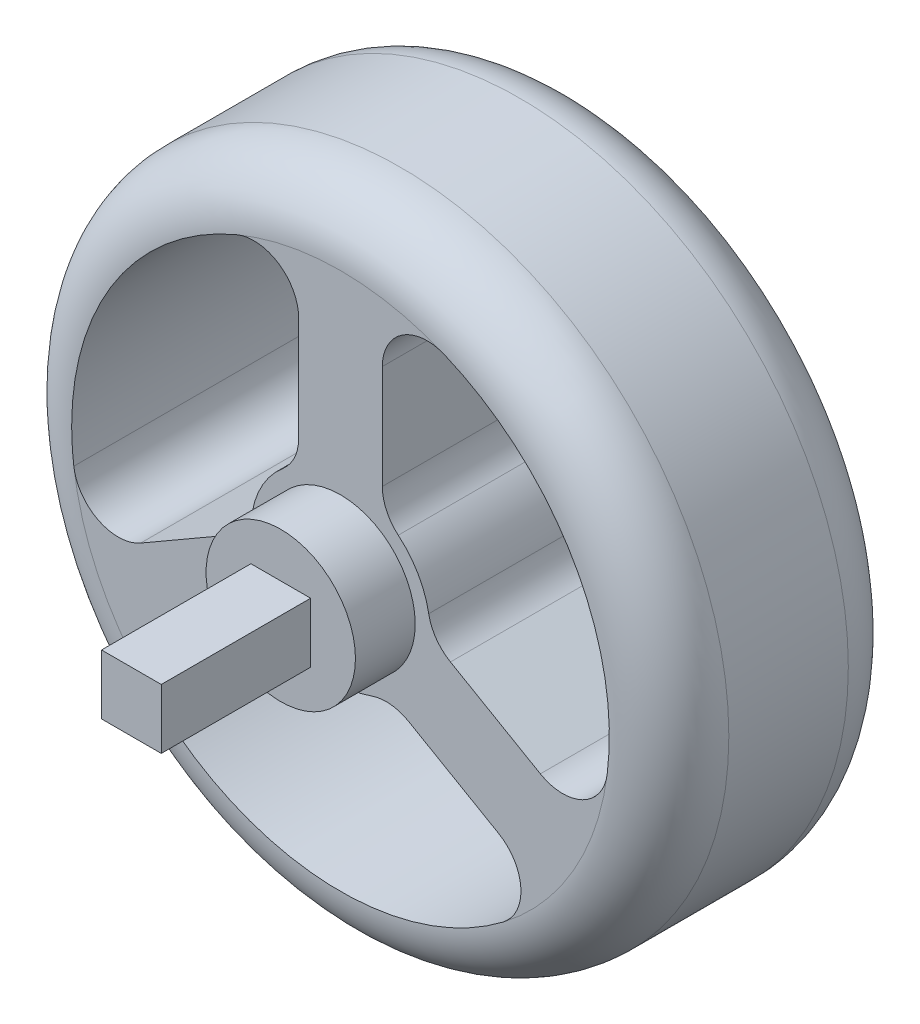
ISO-10303-21;
HEADER;
FILE_DESCRIPTION(('STEP AP214'),'2;1');
FILE_NAME('part.step','',(''),(''),'','','');
FILE_SCHEMA(('AUTOMOTIVE_DESIGN { 1 0 10303 214 1 1 1 1 }'));
ENDSEC;
DATA;
#1=APPLICATION_CONTEXT('core data for automotive mechanical design processes');
#2=APPLICATION_PROTOCOL_DEFINITION('international standard','automotive_design',2000,#1);
#3=PRODUCT_CONTEXT('',#1,'mechanical');
#4=PRODUCT('Part','Part','',(#3));
#5=PRODUCT_RELATED_PRODUCT_CATEGORY('part','',(#4));
#6=PRODUCT_DEFINITION_FORMATION('','',#4);
#7=PRODUCT_DEFINITION_CONTEXT('part definition',#1,'design');
#8=PRODUCT_DEFINITION('design','',#6,#7);
#9=PRODUCT_DEFINITION_SHAPE('','',#8);
#10=(LENGTH_UNIT() NAMED_UNIT(*) SI_UNIT(.MILLI.,.METRE.));
#11=(NAMED_UNIT(*) PLANE_ANGLE_UNIT() SI_UNIT($,.RADIAN.));
#12=(NAMED_UNIT(*) SI_UNIT($,.STERADIAN.) SOLID_ANGLE_UNIT());
#13=UNCERTAINTY_MEASURE_WITH_UNIT(LENGTH_MEASURE(1.E-05),#10,'distance_accuracy_value','');
#14=(GEOMETRIC_REPRESENTATION_CONTEXT(3) GLOBAL_UNCERTAINTY_ASSIGNED_CONTEXT((#13)) GLOBAL_UNIT_ASSIGNED_CONTEXT((#10,
#11,#12)) REPRESENTATION_CONTEXT('',''));
#15=CARTESIAN_POINT('',(0.,0.,0.));
#16=DIRECTION('',(0.,0.,1.));
#17=DIRECTION('',(1.,0.,0.));
#18=AXIS2_PLACEMENT_3D('',#15,#16,#17);
#19=CARTESIAN_POINT('',(0.,0.,-15.24));
#20=DIRECTION('',(0.,0.,1.));
#21=DIRECTION('',(1.,0.,0.));
#22=AXIS2_PLACEMENT_3D('',#19,#20,#21);
#23=PLANE('',#22);
#24=CARTESIAN_POINT('',(0.,0.,-15.24));
#25=DIRECTION('',(0.,0.,1.));
#26=DIRECTION('',(1.,0.,0.));
#27=AXIS2_PLACEMENT_3D('',#24,#25,#26);
#28=CIRCLE('',#27,6.35);
#29=CARTESIAN_POINT('',(6.35,0.,-15.24));
#30=VERTEX_POINT('',#29);
#31=EDGE_CURVE('E245',#30,#30,#28,.T.);
#32=ORIENTED_EDGE('',*,*,#31,.T.);
#33=EDGE_LOOP('',(#32));
#34=FACE_BOUND('',#33,.T.);
#35=DIRECTION('',(1.,0.,0.));
#36=VECTOR('',#35,1.);
#37=CARTESIAN_POINT('',(2.54,-2.54,-15.24));
#38=LINE('',#37,#36);
#39=CARTESIAN_POINT('',(-2.54,-2.54,-15.24));
#40=VERTEX_POINT('',#39);
#41=CARTESIAN_POINT('',(2.54,-2.54,-15.24));
#42=VERTEX_POINT('',#41);
#43=EDGE_CURVE('E859',#40,#42,#38,.T.);
#44=ORIENTED_EDGE('',*,*,#43,.F.);
#45=DIRECTION('',(0.,-1.,0.));
#46=VECTOR('',#45,1.);
#47=CARTESIAN_POINT('',(-2.54,2.54,-15.24));
#48=LINE('',#47,#46);
#49=CARTESIAN_POINT('',(-2.54,2.54,-15.24));
#50=VERTEX_POINT('',#49);
#51=EDGE_CURVE('E243',#50,#40,#48,.T.);
#52=ORIENTED_EDGE('',*,*,#51,.F.);
#53=DIRECTION('',(-1.,0.,0.));
#54=VECTOR('',#53,1.);
#55=CARTESIAN_POINT('',(2.54,2.54,-15.24));
#56=LINE('',#55,#54);
#57=CARTESIAN_POINT('',(2.54,2.54,-15.24));
#58=VERTEX_POINT('',#57);
#59=EDGE_CURVE('E239',#58,#50,#56,.T.);
#60=ORIENTED_EDGE('',*,*,#59,.F.);
#61=DIRECTION('',(0.,1.,0.));
#62=VECTOR('',#61,1.);
#63=CARTESIAN_POINT('',(2.54,2.54,-15.24));
#64=LINE('',#63,#62);
#65=EDGE_CURVE('E856',#42,#58,#64,.T.);
#66=ORIENTED_EDGE('',*,*,#65,.F.);
#67=EDGE_LOOP('',(#44,#52,#60,#66));
#68=FACE_BOUND('',#67,.T.);
#69=ADVANCED_FACE('F35',(#34,#68),#23,.T.);
#70=CARTESIAN_POINT('',(0.,0.,-20.32));
#71=DIRECTION('',(0.,0.,1.));
#72=DIRECTION('',(1.,0.,0.));
#73=AXIS2_PLACEMENT_3D('',#70,#71,#72);
#74=CYLINDRICAL_SURFACE('',#73,6.35);
#75=CARTESIAN_POINT('',(0.,0.,-20.32));
#76=DIRECTION('',(0.,0.,-1.));
#77=DIRECTION('',(-1.,0.,0.));
#78=AXIS2_PLACEMENT_3D('',#75,#76,#77);
#79=CIRCLE('',#78,6.35);
#80=CARTESIAN_POINT('',(-6.35,0.,-20.32));
#81=VERTEX_POINT('',#80);
#82=EDGE_CURVE('E395',#81,#81,#79,.T.);
#83=ORIENTED_EDGE('',*,*,#82,.F.);
#84=EDGE_LOOP('',(#83));
#85=FACE_BOUND('',#84,.T.);
#86=ORIENTED_EDGE('',*,*,#31,.F.);
#87=EDGE_LOOP('',(#86));
#88=FACE_BOUND('',#87,.T.);
#89=ADVANCED_FACE('F537',(#85,#88),#74,.T.);
#90=CARTESIAN_POINT('',(0.,0.,-40.64));
#91=DIRECTION('',(0.,0.,-1.));
#92=DIRECTION('',(-1.,0.,0.));
#93=AXIS2_PLACEMENT_3D('',#90,#91,#92);
#94=PLANE('',#93);
#95=CARTESIAN_POINT('',(7.366,17.5682823292432,-40.64));
#96=DIRECTION('',(0.,0.,-1.));
#97=DIRECTION('',(-1.,0.,0.));
#98=AXIS2_PLACEMENT_3D('',#95,#96,#97);
#99=CIRCLE('',#98,3.81);
#100=CARTESIAN_POINT('',(3.556,17.5682823292432,-40.64));
#101=VERTEX_POINT('',#100);
#102=CARTESIAN_POINT('',(8.8392,21.0819387950919,-40.64));
#103=VERTEX_POINT('',#102);
#104=EDGE_CURVE('E274',#101,#103,#99,.T.);
#105=ORIENTED_EDGE('',*,*,#104,.F.);
#106=DIRECTION('',(0.,1.,0.));
#107=VECTOR('',#106,1.);
#108=CARTESIAN_POINT('',(3.556,8.73996247131531,-40.64));
#109=LINE('',#108,#107);
#110=CARTESIAN_POINT('',(3.556,8.73996247131531,-40.64));
#111=VERTEX_POINT('',#110);
#112=EDGE_CURVE('E271',#111,#101,#109,.T.);
#113=ORIENTED_EDGE('',*,*,#112,.F.);
#114=CARTESIAN_POINT('',(7.366,8.73996247131531,-40.64));
#115=DIRECTION('',(0.,0.,-1.));
#116=DIRECTION('',(-1.,0.,0.));
#117=AXIS2_PLACEMENT_3D('',#114,#115,#116);
#118=CIRCLE('',#117,3.81);
#119=CARTESIAN_POINT('',(4.91066666666667,5.82664164754354,-40.64));
#120=VERTEX_POINT('',#119);
#121=EDGE_CURVE('E268',#120,#111,#118,.T.);
#122=ORIENTED_EDGE('',*,*,#121,.F.);
#123=CARTESIAN_POINT('',(0.,0.,-40.64));
#124=DIRECTION('',(0.,0.,1.));
#125=DIRECTION('',(-1.,0.,0.));
#126=AXIS2_PLACEMENT_3D('',#123,#124,#125);
#127=CIRCLE('',#126,7.62);
#128=CARTESIAN_POINT('',(7.50135301885445,1.33944125907901,-40.64));
#129=VERTEX_POINT('',#128);
#130=EDGE_CURVE('E265',#129,#120,#127,.T.);
#131=ORIENTED_EDGE('',*,*,#130,.F.);
#132=CARTESIAN_POINT('',(11.2520295282817,2.00916188861851,-40.64));
#133=DIRECTION('',(0.,0.,-1.));
#134=DIRECTION('',(-1.,0.,0.));
#135=AXIS2_PLACEMENT_3D('',#132,#133,#134);
#136=CIRCLE('',#135,3.81);
#137=CARTESIAN_POINT('',(9.34702952828168,-1.29039489980019,-40.64));
#138=VERTEX_POINT('',#137);
#139=EDGE_CURVE('E262',#138,#129,#136,.T.);
#140=ORIENTED_EDGE('',*,*,#139,.F.);
#141=DIRECTION('',(-0.866025403784438,0.5,0.));
#142=VECTOR('',#141,1.);
#143=CARTESIAN_POINT('',(9.34702952828168,-1.29039489980019,-40.64));
#144=LINE('',#143,#142);
#145=CARTESIAN_POINT('',(16.9925787979819,-5.70455482876416,-40.64));
#146=VERTEX_POINT('',#145);
#147=EDGE_CURVE('E259',#146,#138,#144,.T.);
#148=ORIENTED_EDGE('',*,*,#147,.F.);
#149=CARTESIAN_POINT('',(18.8975787979819,-2.40499804034545,-40.64));
#150=DIRECTION('',(0.,0.,-1.));
#151=DIRECTION('',(-1.,0.,0.));
#152=AXIS2_PLACEMENT_3D('',#149,#150,#151);
#153=CIRCLE('',#152,3.81);
#154=CARTESIAN_POINT('',(22.6770945575783,-2.88599764841454,-40.64));
#155=VERTEX_POINT('',#154);
#156=EDGE_CURVE('E255',#155,#146,#153,.T.);
#157=ORIENTED_EDGE('',*,*,#156,.F.);
#158=CARTESIAN_POINT('',(0.,0.,-40.64));
#159=DIRECTION('',(0.,0.,-1.));
#160=DIRECTION('',(-1.,0.,0.));
#161=AXIS2_PLACEMENT_3D('',#158,#159,#160);
#162=CIRCLE('',#161,22.86);
#163=CARTESIAN_POINT('',(13.8378945575783,-18.1959411466774,-40.64));
#164=VERTEX_POINT('',#163);
#165=EDGE_CURVE('E411',#155,#164,#162,.T.);
#166=ORIENTED_EDGE('',*,*,#165,.T.);
#167=CARTESIAN_POINT('',(11.5315787979819,-15.1632842888978,-40.64));
#168=DIRECTION('',(0.,0.,-1.));
#169=DIRECTION('',(-1.,0.,0.));
#170=AXIS2_PLACEMENT_3D('',#167,#168,#169);
#171=CIRCLE('',#170,3.81);
#172=CARTESIAN_POINT('',(13.4365787979819,-11.8637275004791,-40.64));
#173=VERTEX_POINT('',#172);
#174=EDGE_CURVE('E304',#173,#164,#171,.T.);
#175=ORIENTED_EDGE('',*,*,#174,.F.);
#176=DIRECTION('',(0.866025403784438,-0.500000000000001,0.));
#177=VECTOR('',#176,1.);
#178=CARTESIAN_POINT('',(5.79102952828168,-7.44956757151512,-40.64));
#179=LINE('',#178,#177);
#180=CARTESIAN_POINT('',(5.79102952828168,-7.44956757151512,-40.64));
#181=VERTEX_POINT('',#180);
#182=EDGE_CURVE('E301',#181,#173,#179,.T.);
#183=ORIENTED_EDGE('',*,*,#182,.F.);
#184=CARTESIAN_POINT('',(3.88602952828167,-10.7491243599338,-40.64));
#185=DIRECTION('',(0.,0.,-1.));
#186=DIRECTION('',(-1.,0.,0.));
#187=AXIS2_PLACEMENT_3D('',#184,#185,#186);
#188=CIRCLE('',#187,3.81);
#189=CARTESIAN_POINT('',(2.59068635218779,-7.16608290662255,-40.64));
#190=VERTEX_POINT('',#189);
#191=EDGE_CURVE('E298',#190,#181,#188,.T.);
#192=ORIENTED_EDGE('',*,*,#191,.F.);
#193=CARTESIAN_POINT('',(0.,0.,-40.64));
#194=DIRECTION('',(0.,0.,1.));
#195=DIRECTION('',(-1.,0.,0.));
#196=AXIS2_PLACEMENT_3D('',#193,#194,#195);
#197=CIRCLE('',#196,7.62);
#198=CARTESIAN_POINT('',(-2.59068635218779,-7.16608290662255,-40.64));
#199=VERTEX_POINT('',#198);
#200=EDGE_CURVE('E295',#199,#190,#197,.T.);
#201=ORIENTED_EDGE('',*,*,#200,.F.);
#202=CARTESIAN_POINT('',(-3.88602952828168,-10.7491243599338,-40.64));
#203=DIRECTION('',(0.,0.,-1.));
#204=DIRECTION('',(-1.,0.,0.));
#205=AXIS2_PLACEMENT_3D('',#202,#203,#204);
#206=CIRCLE('',#205,3.81);
#207=CARTESIAN_POINT('',(-5.79102952828168,-7.44956757151512,-40.64));
#208=VERTEX_POINT('',#207);
#209=EDGE_CURVE('E248',#208,#199,#206,.T.);
#210=ORIENTED_EDGE('',*,*,#209,.F.);
#211=DIRECTION('',(0.866025403784439,0.5,0.));
#212=VECTOR('',#211,1.);
#213=CARTESIAN_POINT('',(-5.79102952828168,-7.44956757151512,-40.64));
#214=LINE('',#213,#212);
#215=CARTESIAN_POINT('',(-13.4365787979819,-11.8637275004791,-40.64));
#216=VERTEX_POINT('',#215);
#217=EDGE_CURVE('E312',#216,#208,#214,.T.);
#218=ORIENTED_EDGE('',*,*,#217,.F.);
#219=CARTESIAN_POINT('',(-11.5315787979819,-15.1632842888978,-40.64));
#220=DIRECTION('',(0.,0.,-1.));
#221=DIRECTION('',(-1.,0.,0.));
#222=AXIS2_PLACEMENT_3D('',#219,#220,#221);
#223=CIRCLE('',#222,3.81);
#224=CARTESIAN_POINT('',(-13.8378945575783,-18.1959411466773,-40.64));
#225=VERTEX_POINT('',#224);
#226=EDGE_CURVE('E309',#225,#216,#223,.T.);
#227=ORIENTED_EDGE('',*,*,#226,.F.);
#228=CARTESIAN_POINT('',(-22.6770945575783,-2.88599764841453,-40.64));
#229=VERTEX_POINT('',#228);
#230=EDGE_CURVE('E405',#225,#229,#162,.T.);
#231=ORIENTED_EDGE('',*,*,#230,.T.);
#232=CARTESIAN_POINT('',(-18.8975787979819,-2.40499804034543,-40.64));
#233=DIRECTION('',(0.,0.,-1.));
#234=DIRECTION('',(-1.,0.,0.));
#235=AXIS2_PLACEMENT_3D('',#232,#233,#234);
#236=CIRCLE('',#235,3.81);
#237=CARTESIAN_POINT('',(-16.9925787979819,-5.70455482876414,-40.64));
#238=VERTEX_POINT('',#237);
#239=EDGE_CURVE('E367',#238,#229,#236,.T.);
#240=ORIENTED_EDGE('',*,*,#239,.F.);
#241=DIRECTION('',(-0.866025403784439,-0.5,0.));
#242=VECTOR('',#241,1.);
#243=CARTESIAN_POINT('',(-9.34702952828168,-1.29039489980019,-40.64));
#244=LINE('',#243,#242);
#245=CARTESIAN_POINT('',(-9.34702952828168,-1.29039489980019,-40.64));
#246=VERTEX_POINT('',#245);
#247=EDGE_CURVE('E364',#246,#238,#244,.T.);
#248=ORIENTED_EDGE('',*,*,#247,.F.);
#249=CARTESIAN_POINT('',(-11.2520295282817,2.00916188861852,-40.64));
#250=DIRECTION('',(0.,0.,-1.));
#251=DIRECTION('',(-1.,0.,0.));
#252=AXIS2_PLACEMENT_3D('',#249,#250,#251);
#253=CIRCLE('',#252,3.81);
#254=CARTESIAN_POINT('',(-7.50135301885445,1.33944125907902,-40.64));
#255=VERTEX_POINT('',#254);
#256=EDGE_CURVE('E361',#255,#246,#253,.T.);
#257=ORIENTED_EDGE('',*,*,#256,.F.);
#258=CARTESIAN_POINT('',(0.,0.,-40.64));
#259=DIRECTION('',(0.,0.,1.));
#260=DIRECTION('',(-1.,0.,0.));
#261=AXIS2_PLACEMENT_3D('',#258,#259,#260);
#262=CIRCLE('',#261,7.62);
#263=CARTESIAN_POINT('',(-4.91066666666667,5.82664164754354,-40.64));
#264=VERTEX_POINT('',#263);
#265=EDGE_CURVE('E358',#264,#255,#262,.T.);
#266=ORIENTED_EDGE('',*,*,#265,.F.);
#267=CARTESIAN_POINT('',(-7.366,8.73996247131531,-40.64));
#268=DIRECTION('',(0.,0.,-1.));
#269=DIRECTION('',(-1.,0.,0.));
#270=AXIS2_PLACEMENT_3D('',#267,#268,#269);
#271=CIRCLE('',#270,3.81);
#272=CARTESIAN_POINT('',(-3.556,8.73996247131531,-40.64));
#273=VERTEX_POINT('',#272);
#274=EDGE_CURVE('E355',#273,#264,#271,.T.);
#275=ORIENTED_EDGE('',*,*,#274,.F.);
#276=DIRECTION('',(0.,-1.,0.));
#277=VECTOR('',#276,1.);
#278=CARTESIAN_POINT('',(-3.556,8.73996247131531,-40.64));
#279=LINE('',#278,#277);
#280=CARTESIAN_POINT('',(-3.556,17.5682823292432,-40.64));
#281=VERTEX_POINT('',#280);
#282=EDGE_CURVE('E352',#281,#273,#279,.T.);
#283=ORIENTED_EDGE('',*,*,#282,.F.);
#284=CARTESIAN_POINT('',(-7.366,17.5682823292432,-40.64));
#285=DIRECTION('',(0.,0.,-1.));
#286=DIRECTION('',(-1.,0.,0.));
#287=AXIS2_PLACEMENT_3D('',#284,#285,#286);
#288=CIRCLE('',#287,3.81);
#289=CARTESIAN_POINT('',(-8.8392,21.0819387950919,-40.64));
#290=VERTEX_POINT('',#289);
#291=EDGE_CURVE('E349',#290,#281,#288,.T.);
#292=ORIENTED_EDGE('',*,*,#291,.F.);
#293=EDGE_CURVE('E407',#290,#103,#162,.T.);
#294=ORIENTED_EDGE('',*,*,#293,.T.);
#295=EDGE_LOOP('',(#105,#113,#122,#131,#140,#148,#157,#166,#175,#183,#192,#201,#210,#218,#227,
#231,#240,#248,#257,#266,#275,#283,#292,#294));
#296=FACE_BOUND('',#295,.T.);
#297=ADVANCED_FACE('F468',(#296),#94,.T.);
#298=CARTESIAN_POINT('',(0.,0.,-20.32));
#299=DIRECTION('',(0.,0.,-1.));
#300=DIRECTION('',(-1.,0.,0.));
#301=AXIS2_PLACEMENT_3D('',#298,#299,#300);
#302=PLANE('',#301);
#303=ORIENTED_EDGE('',*,*,#82,.T.);
#304=EDGE_LOOP('',(#303));
#305=FACE_BOUND('',#304,.T.);
#306=DIRECTION('',(0.,1.,0.));
#307=VECTOR('',#306,1.);
#308=CARTESIAN_POINT('',(3.556,0.,-20.32));
#309=LINE('',#308,#307);
#310=CARTESIAN_POINT('',(3.556,8.73996247131531,-20.32));
#311=VERTEX_POINT('',#310);
#312=CARTESIAN_POINT('',(3.556,17.5682823292432,-20.32));
#313=VERTEX_POINT('',#312);
#314=EDGE_CURVE('E11',#311,#313,#309,.T.);
#315=ORIENTED_EDGE('',*,*,#314,.T.);
#316=CARTESIAN_POINT('',(7.366,17.5682823292432,-20.32));
#317=DIRECTION('',(0.,0.,-1.));
#318=DIRECTION('',(-1.,0.,0.));
#319=AXIS2_PLACEMENT_3D('',#316,#317,#318);
#320=CIRCLE('',#319,3.81);
#321=CARTESIAN_POINT('',(8.8392,21.0819387950919,-20.32));
#322=VERTEX_POINT('',#321);
#323=EDGE_CURVE('E341',#313,#322,#320,.T.);
#324=ORIENTED_EDGE('',*,*,#323,.T.);
#325=CARTESIAN_POINT('',(0.,0.,-20.32));
#326=DIRECTION('',(0.,0.,-1.));
#327=DIRECTION('',(-1.,0.,0.));
#328=AXIS2_PLACEMENT_3D('',#325,#326,#327);
#329=CIRCLE('',#328,22.86);
#330=CARTESIAN_POINT('',(-8.8392,21.0819387950919,-20.32));
#331=VERTEX_POINT('',#330);
#332=EDGE_CURVE('E401',#322,#331,#329,.F.);
#333=ORIENTED_EDGE('',*,*,#332,.T.);
#334=CARTESIAN_POINT('',(-7.366,17.5682823292432,-20.32));
#335=DIRECTION('',(0.,0.,-1.));
#336=DIRECTION('',(-1.,0.,0.));
#337=AXIS2_PLACEMENT_3D('',#334,#335,#336);
#338=CIRCLE('',#337,3.81);
#339=CARTESIAN_POINT('',(-3.556,17.5682823292432,-20.32));
#340=VERTEX_POINT('',#339);
#341=EDGE_CURVE('E374',#331,#340,#338,.T.);
#342=ORIENTED_EDGE('',*,*,#341,.T.);
#343=DIRECTION('',(0.,-1.,0.));
#344=VECTOR('',#343,1.);
#345=CARTESIAN_POINT('',(-3.556,0.,-20.32));
#346=LINE('',#345,#344);
#347=CARTESIAN_POINT('',(-3.556,8.73996247131531,-20.32));
#348=VERTEX_POINT('',#347);
#349=EDGE_CURVE('E414',#340,#348,#346,.T.);
#350=ORIENTED_EDGE('',*,*,#349,.T.);
#351=CARTESIAN_POINT('',(-7.366,8.73996247131531,-20.32));
#352=DIRECTION('',(0.,0.,-1.));
#353=DIRECTION('',(-1.,0.,0.));
#354=AXIS2_PLACEMENT_3D('',#351,#352,#353);
#355=CIRCLE('',#354,3.81);
#356=CARTESIAN_POINT('',(-4.91066666666667,5.82664164754354,-20.32));
#357=VERTEX_POINT('',#356);
#358=EDGE_CURVE('E417',#348,#357,#355,.T.);
#359=ORIENTED_EDGE('',*,*,#358,.T.);
#360=CARTESIAN_POINT('',(0.,0.,-20.32));
#361=DIRECTION('',(0.,0.,-1.));
#362=DIRECTION('',(-1.,0.,0.));
#363=AXIS2_PLACEMENT_3D('',#360,#361,#362);
#364=CIRCLE('',#363,7.62);
#365=CARTESIAN_POINT('',(-7.50135301885445,1.33944125907902,-20.32));
#366=VERTEX_POINT('',#365);
#367=EDGE_CURVE('E420',#357,#366,#364,.F.);
#368=ORIENTED_EDGE('',*,*,#367,.T.);
#369=CARTESIAN_POINT('',(-11.2520295282817,2.00916188861852,-20.32));
#370=DIRECTION('',(0.,0.,-1.));
#371=DIRECTION('',(-1.,0.,0.));
#372=AXIS2_PLACEMENT_3D('',#369,#370,#371);
#373=CIRCLE('',#372,3.81);
#374=CARTESIAN_POINT('',(-9.34702952828168,-1.29039489980019,-20.32));
#375=VERTEX_POINT('',#374);
#376=EDGE_CURVE('E423',#366,#375,#373,.T.);
#377=ORIENTED_EDGE('',*,*,#376,.T.);
#378=DIRECTION('',(-0.866025403784439,-0.5,0.));
#379=VECTOR('',#378,1.);
#380=CARTESIAN_POINT('',(-1.778,3.07958633585746,-20.32));
#381=LINE('',#380,#379);
#382=CARTESIAN_POINT('',(-16.9925787979819,-5.70455482876414,-20.32));
#383=VERTEX_POINT('',#382);
#384=EDGE_CURVE('E426',#375,#383,#381,.T.);
#385=ORIENTED_EDGE('',*,*,#384,.T.);
#386=CARTESIAN_POINT('',(-18.8975787979819,-2.40499804034543,-20.32));
#387=DIRECTION('',(0.,0.,-1.));
#388=DIRECTION('',(-1.,0.,0.));
#389=AXIS2_PLACEMENT_3D('',#386,#387,#388);
#390=CIRCLE('',#389,3.81);
#391=CARTESIAN_POINT('',(-22.6770945575783,-2.88599764841452,-20.32));
#392=VERTEX_POINT('',#391);
#393=EDGE_CURVE('E390',#383,#392,#390,.T.);
#394=ORIENTED_EDGE('',*,*,#393,.T.);
#395=CARTESIAN_POINT('',(-13.8378945575783,-18.1959411466773,-20.32));
#396=VERTEX_POINT('',#395);
#397=EDGE_CURVE('E402',#392,#396,#329,.F.);
#398=ORIENTED_EDGE('',*,*,#397,.T.);
#399=CARTESIAN_POINT('',(-11.5315787979819,-15.1632842888978,-20.32));
#400=DIRECTION('',(0.,0.,-1.));
#401=DIRECTION('',(-1.,0.,0.));
#402=AXIS2_PLACEMENT_3D('',#399,#400,#401);
#403=CIRCLE('',#402,3.81);
#404=CARTESIAN_POINT('',(-13.4365787979819,-11.8637275004791,-20.32));
#405=VERTEX_POINT('',#404);
#406=EDGE_CURVE('E335',#396,#405,#403,.T.);
#407=ORIENTED_EDGE('',*,*,#406,.T.);
#408=DIRECTION('',(0.866025403784439,0.5,0.));
#409=VECTOR('',#408,1.);
#410=CARTESIAN_POINT('',(1.778,-3.07958633585746,-20.32));
#411=LINE('',#410,#409);
#412=CARTESIAN_POINT('',(-5.79102952828168,-7.44956757151512,-20.32));
#413=VERTEX_POINT('',#412);
#414=EDGE_CURVE('E441',#405,#413,#411,.T.);
#415=ORIENTED_EDGE('',*,*,#414,.T.);
#416=CARTESIAN_POINT('',(-3.88602952828168,-10.7491243599338,-20.32));
#417=DIRECTION('',(0.,0.,-1.));
#418=DIRECTION('',(-1.,0.,0.));
#419=AXIS2_PLACEMENT_3D('',#416,#417,#418);
#420=CIRCLE('',#419,3.81);
#421=CARTESIAN_POINT('',(-2.59068635218779,-7.16608290662255,-20.32));
#422=VERTEX_POINT('',#421);
#423=EDGE_CURVE('E438',#413,#422,#420,.T.);
#424=ORIENTED_EDGE('',*,*,#423,.T.);
#425=CARTESIAN_POINT('',(0.,0.,-20.32));
#426=DIRECTION('',(0.,0.,-1.));
#427=DIRECTION('',(-1.,0.,0.));
#428=AXIS2_PLACEMENT_3D('',#425,#426,#427);
#429=CIRCLE('',#428,7.62);
#430=CARTESIAN_POINT('',(2.59068635218779,-7.16608290662255,-20.32));
#431=VERTEX_POINT('',#430);
#432=EDGE_CURVE('E429',#422,#431,#429,.F.);
#433=ORIENTED_EDGE('',*,*,#432,.T.);
#434=CARTESIAN_POINT('',(3.88602952828167,-10.7491243599338,-20.32));
#435=DIRECTION('',(0.,0.,-1.));
#436=DIRECTION('',(-1.,0.,0.));
#437=AXIS2_PLACEMENT_3D('',#434,#435,#436);
#438=CIRCLE('',#437,3.81);
#439=CARTESIAN_POINT('',(5.79102952828168,-7.44956757151512,-20.32));
#440=VERTEX_POINT('',#439);
#441=EDGE_CURVE('E432',#431,#440,#438,.T.);
#442=ORIENTED_EDGE('',*,*,#441,.T.);
#443=DIRECTION('',(0.866025403784438,-0.500000000000001,0.));
#444=VECTOR('',#443,1.);
#445=CARTESIAN_POINT('',(-1.778,-3.07958633585746,-20.32));
#446=LINE('',#445,#444);
#447=CARTESIAN_POINT('',(13.4365787979819,-11.8637275004791,-20.32));
#448=VERTEX_POINT('',#447);
#449=EDGE_CURVE('E435',#440,#448,#446,.T.);
#450=ORIENTED_EDGE('',*,*,#449,.T.);
#451=CARTESIAN_POINT('',(11.5315787979819,-15.1632842888978,-20.32));
#452=DIRECTION('',(0.,0.,-1.));
#453=DIRECTION('',(-1.,0.,0.));
#454=AXIS2_PLACEMENT_3D('',#451,#452,#453);
#455=CIRCLE('',#454,3.81);
#456=CARTESIAN_POINT('',(13.8378945575782,-18.1959411466774,-20.32));
#457=VERTEX_POINT('',#456);
#458=EDGE_CURVE('E279',#448,#457,#455,.T.);
#459=ORIENTED_EDGE('',*,*,#458,.T.);
#460=CARTESIAN_POINT('',(22.6770945575783,-2.88599764841454,-20.32));
#461=VERTEX_POINT('',#460);
#462=EDGE_CURVE('E406',#457,#461,#329,.F.);
#463=ORIENTED_EDGE('',*,*,#462,.T.);
#464=CARTESIAN_POINT('',(18.8975787979819,-2.40499804034545,-20.32));
#465=DIRECTION('',(0.,0.,-1.));
#466=DIRECTION('',(-1.,0.,0.));
#467=AXIS2_PLACEMENT_3D('',#464,#465,#466);
#468=CIRCLE('',#467,3.81);
#469=CARTESIAN_POINT('',(16.9925787979819,-5.70455482876416,-20.32));
#470=VERTEX_POINT('',#469);
#471=EDGE_CURVE('E338',#461,#470,#468,.T.);
#472=ORIENTED_EDGE('',*,*,#471,.T.);
#473=DIRECTION('',(-0.866025403784438,0.5,0.));
#474=VECTOR('',#473,1.);
#475=CARTESIAN_POINT('',(1.778,3.07958633585746,-20.32));
#476=LINE('',#475,#474);
#477=CARTESIAN_POINT('',(9.34702952828168,-1.29039489980019,-20.32));
#478=VERTEX_POINT('',#477);
#479=EDGE_CURVE('E444',#470,#478,#476,.T.);
#480=ORIENTED_EDGE('',*,*,#479,.T.);
#481=CARTESIAN_POINT('',(11.2520295282817,2.00916188861851,-20.32));
#482=DIRECTION('',(0.,0.,-1.));
#483=DIRECTION('',(-1.,0.,0.));
#484=AXIS2_PLACEMENT_3D('',#481,#482,#483);
#485=CIRCLE('',#484,3.81);
#486=CARTESIAN_POINT('',(7.50135301885445,1.33944125907901,-20.32));
#487=VERTEX_POINT('',#486);
#488=EDGE_CURVE('E447',#478,#487,#485,.T.);
#489=ORIENTED_EDGE('',*,*,#488,.T.);
#490=CARTESIAN_POINT('',(0.,0.,-20.32));
#491=DIRECTION('',(0.,0.,-1.));
#492=DIRECTION('',(-1.,0.,0.));
#493=AXIS2_PLACEMENT_3D('',#490,#491,#492);
#494=CIRCLE('',#493,7.62);
#495=CARTESIAN_POINT('',(4.91066666666667,5.82664164754354,-20.32));
#496=VERTEX_POINT('',#495);
#497=EDGE_CURVE('E450',#487,#496,#494,.F.);
#498=ORIENTED_EDGE('',*,*,#497,.T.);
#499=CARTESIAN_POINT('',(7.366,8.73996247131531,-20.32));
#500=DIRECTION('',(0.,0.,-1.));
#501=DIRECTION('',(-1.,0.,0.));
#502=AXIS2_PLACEMENT_3D('',#499,#500,#501);
#503=CIRCLE('',#502,3.81);
#504=EDGE_CURVE('E43',#496,#311,#503,.T.);
#505=ORIENTED_EDGE('',*,*,#504,.T.);
#506=EDGE_LOOP('',(#315,#324,#333,#342,#350,#359,#368,#377,#385,#394,#398,#407,#415,#424,#433,
#442,#450,#459,#463,#472,#480,#489,#498,#505));
#507=FACE_BOUND('',#506,.T.);
#508=ADVANCED_FACE('F454',(#305,#507),#302,.F.);
#509=CARTESIAN_POINT('',(0.,0.,-40.64));
#510=DIRECTION('',(0.,0.,1.));
#511=DIRECTION('',(1.,0.,0.));
#512=AXIS2_PLACEMENT_3D('',#509,#510,#511);
#513=CYLINDRICAL_SURFACE('',#512,27.94);
#514=CARTESIAN_POINT('',(0.,0.,-35.56));
#515=DIRECTION('',(0.,0.,-1.));
#516=DIRECTION('',(-1.,0.,0.));
#517=AXIS2_PLACEMENT_3D('',#514,#515,#516);
#518=CIRCLE('',#517,27.94);
#519=CARTESIAN_POINT('',(-27.94,0.,-35.56));
#520=VERTEX_POINT('',#519);
#521=EDGE_CURVE('E410',#520,#520,#518,.F.);
#522=ORIENTED_EDGE('',*,*,#521,.T.);
#523=EDGE_LOOP('',(#522));
#524=FACE_BOUND('',#523,.T.);
#525=CARTESIAN_POINT('',(0.,0.,-25.4));
#526=DIRECTION('',(0.,0.,-1.));
#527=DIRECTION('',(-1.,0.,0.));
#528=AXIS2_PLACEMENT_3D('',#525,#526,#527);
#529=CIRCLE('',#528,27.94);
#530=CARTESIAN_POINT('',(-27.94,0.,-25.4));
#531=VERTEX_POINT('',#530);
#532=EDGE_CURVE('E398',#531,#531,#529,.T.);
#533=ORIENTED_EDGE('',*,*,#532,.T.);
#534=EDGE_LOOP('',(#533));
#535=FACE_BOUND('',#534,.T.);
#536=ADVANCED_FACE('F814',(#524,#535),#513,.T.);
#537=CARTESIAN_POINT('',(0.,0.,-25.4));
#538=DIRECTION('',(0.,0.,-1.));
#539=DIRECTION('',(-1.,0.,0.));
#540=AXIS2_PLACEMENT_3D('',#537,#538,#539);
#541=TOROIDAL_SURFACE('',#540,22.86,5.08);
#542=ORIENTED_EDGE('',*,*,#397,.F.);
#543=CARTESIAN_POINT('',(0.,0.,-20.32));
#544=DIRECTION('',(0.,0.,-1.));
#545=DIRECTION('',(-1.,0.,0.));
#546=AXIS2_PLACEMENT_3D('',#543,#544,#545);
#547=CIRCLE('',#546,22.86);
#548=EDGE_CURVE('E393',#331,#392,#547,.F.);
#549=ORIENTED_EDGE('',*,*,#548,.F.);
#550=ORIENTED_EDGE('',*,*,#332,.F.);
#551=CARTESIAN_POINT('',(0.,0.,-20.32));
#552=DIRECTION('',(0.,0.,-1.));
#553=DIRECTION('',(-1.,0.,0.));
#554=AXIS2_PLACEMENT_3D('',#551,#552,#553);
#555=CIRCLE('',#554,22.86);
#556=EDGE_CURVE('E344',#461,#322,#555,.F.);
#557=ORIENTED_EDGE('',*,*,#556,.F.);
#558=ORIENTED_EDGE('',*,*,#462,.F.);
#559=CARTESIAN_POINT('',(0.,0.,-20.32));
#560=DIRECTION('',(0.,0.,-1.));
#561=DIRECTION('',(-1.,0.,0.));
#562=AXIS2_PLACEMENT_3D('',#559,#560,#561);
#563=CIRCLE('',#562,22.86);
#564=EDGE_CURVE('E333',#396,#457,#563,.F.);
#565=ORIENTED_EDGE('',*,*,#564,.F.);
#566=EDGE_LOOP('',(#542,#549,#550,#557,#558,#565));
#567=FACE_BOUND('',#566,.T.);
#568=ORIENTED_EDGE('',*,*,#532,.F.);
#569=EDGE_LOOP('',(#568));
#570=FACE_BOUND('',#569,.T.);
#571=ADVANCED_FACE('F481',(#567,#570),#541,.T.);
#572=CARTESIAN_POINT('',(0.,0.,-35.56));
#573=DIRECTION('',(0.,0.,-1.));
#574=DIRECTION('',(-1.,0.,0.));
#575=AXIS2_PLACEMENT_3D('',#572,#573,#574);
#576=TOROIDAL_SURFACE('',#575,22.86,5.08);
#577=ORIENTED_EDGE('',*,*,#521,.F.);
#578=EDGE_LOOP('',(#577));
#579=FACE_BOUND('',#578,.T.);
#580=ORIENTED_EDGE('',*,*,#293,.F.);
#581=CARTESIAN_POINT('',(0.,0.,-40.64));
#582=DIRECTION('',(0.,0.,-1.));
#583=DIRECTION('',(-1.,0.,0.));
#584=AXIS2_PLACEMENT_3D('',#581,#582,#583);
#585=CIRCLE('',#584,22.86);
#586=EDGE_CURVE('E346',#229,#290,#585,.T.);
#587=ORIENTED_EDGE('',*,*,#586,.F.);
#588=ORIENTED_EDGE('',*,*,#230,.F.);
#589=CARTESIAN_POINT('',(0.,0.,-40.64));
#590=DIRECTION('',(0.,0.,-1.));
#591=DIRECTION('',(-1.,0.,0.));
#592=AXIS2_PLACEMENT_3D('',#589,#590,#591);
#593=CIRCLE('',#592,22.86);
#594=EDGE_CURVE('E306',#164,#225,#593,.T.);
#595=ORIENTED_EDGE('',*,*,#594,.F.);
#596=ORIENTED_EDGE('',*,*,#165,.F.);
#597=CARTESIAN_POINT('',(0.,0.,-40.64));
#598=DIRECTION('',(0.,0.,-1.));
#599=DIRECTION('',(-1.,0.,0.));
#600=AXIS2_PLACEMENT_3D('',#597,#598,#599);
#601=CIRCLE('',#600,22.86);
#602=EDGE_CURVE('E253',#103,#155,#601,.T.);
#603=ORIENTED_EDGE('',*,*,#602,.F.);
#604=EDGE_LOOP('',(#580,#587,#588,#595,#596,#603));
#605=FACE_BOUND('',#604,.T.);
#606=ADVANCED_FACE('F37',(#579,#605),#576,.T.);
#607=CARTESIAN_POINT('',(0.,0.,20.32));
#608=DIRECTION('',(0.,0.,-1.));
#609=DIRECTION('',(-1.,0.,0.));
#610=AXIS2_PLACEMENT_3D('',#607,#608,#609);
#611=CYLINDRICAL_SURFACE('',#610,22.86);
#612=ORIENTED_EDGE('',*,*,#548,.T.);
#613=DIRECTION('',(0.,0.,-1.));
#614=VECTOR('',#613,1.);
#615=CARTESIAN_POINT('',(-22.6770945575783,-2.88599764841452,20.32));
#616=LINE('',#615,#614);
#617=EDGE_CURVE('E371',#392,#229,#616,.T.);
#618=ORIENTED_EDGE('',*,*,#617,.T.);
#619=ORIENTED_EDGE('',*,*,#586,.T.);
#620=DIRECTION('',(0.,0.,-1.));
#621=VECTOR('',#620,1.);
#622=CARTESIAN_POINT('',(-8.8392,21.0819387950919,20.32));
#623=LINE('',#622,#621);
#624=EDGE_CURVE('E370',#331,#290,#623,.T.);
#625=ORIENTED_EDGE('',*,*,#624,.F.);
#626=EDGE_LOOP('',(#612,#618,#619,#625));
#627=FACE_BOUND('',#626,.T.);
#628=ADVANCED_FACE('F503',(#627),#611,.F.);
#629=CARTESIAN_POINT('',(-7.366,17.5682823292432,20.32));
#630=DIRECTION('',(0.,0.,-1.));
#631=DIRECTION('',(-1.,0.,0.));
#632=AXIS2_PLACEMENT_3D('',#629,#630,#631);
#633=CYLINDRICAL_SURFACE('',#632,3.81);
#634=ORIENTED_EDGE('',*,*,#624,.T.);
#635=ORIENTED_EDGE('',*,*,#291,.T.);
#636=DIRECTION('',(0.,0.,-1.));
#637=VECTOR('',#636,1.);
#638=CARTESIAN_POINT('',(-3.556,17.5682823292432,20.32));
#639=LINE('',#638,#637);
#640=EDGE_CURVE('E385',#340,#281,#639,.T.);
#641=ORIENTED_EDGE('',*,*,#640,.F.);
#642=ORIENTED_EDGE('',*,*,#341,.F.);
#643=EDGE_LOOP('',(#634,#635,#641,#642));
#644=FACE_BOUND('',#643,.T.);
#645=ADVANCED_FACE('F514',(#644),#633,.F.);
#646=CARTESIAN_POINT('',(-3.556,8.73996247131531,20.32));
#647=DIRECTION('',(1.,0.,0.));
#648=DIRECTION('',(0.,0.,-1.));
#649=AXIS2_PLACEMENT_3D('',#646,#647,#648);
#650=PLANE('',#649);
#651=ORIENTED_EDGE('',*,*,#640,.T.);
#652=ORIENTED_EDGE('',*,*,#282,.T.);
#653=DIRECTION('',(0.,0.,-1.));
#654=VECTOR('',#653,1.);
#655=CARTESIAN_POINT('',(-3.556,8.73996247131531,20.32));
#656=LINE('',#655,#654);
#657=EDGE_CURVE('E383',#348,#273,#656,.T.);
#658=ORIENTED_EDGE('',*,*,#657,.F.);
#659=ORIENTED_EDGE('',*,*,#349,.F.);
#660=EDGE_LOOP('',(#651,#652,#658,#659));
#661=FACE_BOUND('',#660,.T.);
#662=ADVANCED_FACE('F518',(#661),#650,.F.);
#663=CARTESIAN_POINT('',(-7.366,8.73996247131531,20.32));
#664=DIRECTION('',(0.,0.,-1.));
#665=DIRECTION('',(-1.,0.,0.));
#666=AXIS2_PLACEMENT_3D('',#663,#664,#665);
#667=CYLINDRICAL_SURFACE('',#666,3.81);
#668=ORIENTED_EDGE('',*,*,#657,.T.);
#669=ORIENTED_EDGE('',*,*,#274,.T.);
#670=DIRECTION('',(0.,0.,-1.));
#671=VECTOR('',#670,1.);
#672=CARTESIAN_POINT('',(-4.91066666666667,5.82664164754354,20.32));
#673=LINE('',#672,#671);
#674=EDGE_CURVE('E381',#357,#264,#673,.T.);
#675=ORIENTED_EDGE('',*,*,#674,.F.);
#676=ORIENTED_EDGE('',*,*,#358,.F.);
#677=EDGE_LOOP('',(#668,#669,#675,#676));
#678=FACE_BOUND('',#677,.T.);
#679=ADVANCED_FACE('F520',(#678),#667,.F.);
#680=CARTESIAN_POINT('',(0.,0.,20.32));
#681=DIRECTION('',(0.,0.,-1.));
#682=DIRECTION('',(-1.,0.,0.));
#683=AXIS2_PLACEMENT_3D('',#680,#681,#682);
#684=CYLINDRICAL_SURFACE('',#683,7.62);
#685=ORIENTED_EDGE('',*,*,#674,.T.);
#686=ORIENTED_EDGE('',*,*,#265,.T.);
#687=DIRECTION('',(0.,0.,-1.));
#688=VECTOR('',#687,1.);
#689=CARTESIAN_POINT('',(-7.50135301885445,1.33944125907902,20.32));
#690=LINE('',#689,#688);
#691=EDGE_CURVE('E379',#366,#255,#690,.T.);
#692=ORIENTED_EDGE('',*,*,#691,.F.);
#693=ORIENTED_EDGE('',*,*,#367,.F.);
#694=EDGE_LOOP('',(#685,#686,#692,#693));
#695=FACE_BOUND('',#694,.T.);
#696=ADVANCED_FACE('F524',(#695),#684,.T.);
#697=CARTESIAN_POINT('',(-11.2520295282817,2.00916188861852,20.32));
#698=DIRECTION('',(0.,0.,-1.));
#699=DIRECTION('',(-1.,0.,0.));
#700=AXIS2_PLACEMENT_3D('',#697,#698,#699);
#701=CYLINDRICAL_SURFACE('',#700,3.81);
#702=ORIENTED_EDGE('',*,*,#691,.T.);
#703=ORIENTED_EDGE('',*,*,#256,.T.);
#704=DIRECTION('',(0.,0.,-1.));
#705=VECTOR('',#704,1.);
#706=CARTESIAN_POINT('',(-9.34702952828168,-1.29039489980019,20.32));
#707=LINE('',#706,#705);
#708=EDGE_CURVE('E377',#375,#246,#707,.T.);
#709=ORIENTED_EDGE('',*,*,#708,.F.);
#710=ORIENTED_EDGE('',*,*,#376,.F.);
#711=EDGE_LOOP('',(#702,#703,#709,#710));
#712=FACE_BOUND('',#711,.T.);
#713=ADVANCED_FACE('F527',(#712),#701,.F.);
#714=CARTESIAN_POINT('',(-9.34702952828168,-1.29039489980019,20.32));
#715=DIRECTION('',(0.5,-0.866025403784439,0.));
#716=DIRECTION('',(0.866025403784439,0.5,0.));
#717=AXIS2_PLACEMENT_3D('',#714,#715,#716);
#718=PLANE('',#717);
#719=ORIENTED_EDGE('',*,*,#708,.T.);
#720=ORIENTED_EDGE('',*,*,#247,.T.);
#721=DIRECTION('',(0.,0.,-1.));
#722=VECTOR('',#721,1.);
#723=CARTESIAN_POINT('',(-16.9925787979819,-5.70455482876414,20.32));
#724=LINE('',#723,#722);
#725=EDGE_CURVE('E375',#383,#238,#724,.T.);
#726=ORIENTED_EDGE('',*,*,#725,.F.);
#727=ORIENTED_EDGE('',*,*,#384,.F.);
#728=EDGE_LOOP('',(#719,#720,#726,#727));
#729=FACE_BOUND('',#728,.T.);
#730=ADVANCED_FACE('F494',(#729),#718,.F.);
#731=CARTESIAN_POINT('',(-18.8975787979819,-2.40499804034543,20.32));
#732=DIRECTION('',(0.,0.,-1.));
#733=DIRECTION('',(-1.,0.,0.));
#734=AXIS2_PLACEMENT_3D('',#731,#732,#733);
#735=CYLINDRICAL_SURFACE('',#734,3.81);
#736=ORIENTED_EDGE('',*,*,#725,.T.);
#737=ORIENTED_EDGE('',*,*,#239,.T.);
#738=ORIENTED_EDGE('',*,*,#617,.F.);
#739=ORIENTED_EDGE('',*,*,#393,.F.);
#740=EDGE_LOOP('',(#736,#737,#738,#739));
#741=FACE_BOUND('',#740,.T.);
#742=ADVANCED_FACE('F492',(#741),#735,.F.);
#743=CARTESIAN_POINT('',(0.,0.,20.32));
#744=DIRECTION('',(0.,0.,-1.));
#745=DIRECTION('',(-1.,0.,0.));
#746=AXIS2_PLACEMENT_3D('',#743,#744,#745);
#747=CYLINDRICAL_SURFACE('',#746,22.86);
#748=ORIENTED_EDGE('',*,*,#564,.T.);
#749=DIRECTION('',(0.,0.,-1.));
#750=VECTOR('',#749,1.);
#751=CARTESIAN_POINT('',(13.8378945575782,-18.1959411466774,20.32));
#752=LINE('',#751,#750);
#753=EDGE_CURVE('E321',#457,#164,#752,.T.);
#754=ORIENTED_EDGE('',*,*,#753,.T.);
#755=ORIENTED_EDGE('',*,*,#594,.T.);
#756=DIRECTION('',(0.,0.,-1.));
#757=VECTOR('',#756,1.);
#758=CARTESIAN_POINT('',(-13.8378945575783,-18.1959411466773,20.32));
#759=LINE('',#758,#757);
#760=EDGE_CURVE('E319',#396,#225,#759,.T.);
#761=ORIENTED_EDGE('',*,*,#760,.F.);
#762=EDGE_LOOP('',(#748,#754,#755,#761));
#763=FACE_BOUND('',#762,.T.);
#764=ADVANCED_FACE('F582',(#763),#747,.F.);
#765=CARTESIAN_POINT('',(0.,0.,20.32));
#766=DIRECTION('',(0.,0.,-1.));
#767=DIRECTION('',(-1.,0.,0.));
#768=AXIS2_PLACEMENT_3D('',#765,#766,#767);
#769=CYLINDRICAL_SURFACE('',#768,7.62);
#770=DIRECTION('',(0.,0.,-1.));
#771=VECTOR('',#770,1.);
#772=CARTESIAN_POINT('',(-2.59068635218779,-7.16608290662255,20.32));
#773=LINE('',#772,#771);
#774=EDGE_CURVE('E315',#422,#199,#773,.T.);
#775=ORIENTED_EDGE('',*,*,#774,.T.);
#776=ORIENTED_EDGE('',*,*,#200,.T.);
#777=DIRECTION('',(0.,0.,-1.));
#778=VECTOR('',#777,1.);
#779=CARTESIAN_POINT('',(2.59068635218779,-7.16608290662255,20.32));
#780=LINE('',#779,#778);
#781=EDGE_CURVE('E328',#431,#190,#780,.T.);
#782=ORIENTED_EDGE('',*,*,#781,.F.);
#783=ORIENTED_EDGE('',*,*,#432,.F.);
#784=EDGE_LOOP('',(#775,#776,#782,#783));
#785=FACE_BOUND('',#784,.T.);
#786=ADVANCED_FACE('F585',(#785),#769,.T.);
#787=CARTESIAN_POINT('',(3.88602952828167,-10.7491243599338,20.32));
#788=DIRECTION('',(0.,0.,-1.));
#789=DIRECTION('',(-1.,0.,0.));
#790=AXIS2_PLACEMENT_3D('',#787,#788,#789);
#791=CYLINDRICAL_SURFACE('',#790,3.81);
#792=ORIENTED_EDGE('',*,*,#781,.T.);
#793=ORIENTED_EDGE('',*,*,#191,.T.);
#794=DIRECTION('',(0.,0.,-1.));
#795=VECTOR('',#794,1.);
#796=CARTESIAN_POINT('',(5.79102952828168,-7.44956757151512,20.32));
#797=LINE('',#796,#795);
#798=EDGE_CURVE('E326',#440,#181,#797,.T.);
#799=ORIENTED_EDGE('',*,*,#798,.F.);
#800=ORIENTED_EDGE('',*,*,#441,.F.);
#801=EDGE_LOOP('',(#792,#793,#799,#800));
#802=FACE_BOUND('',#801,.T.);
#803=ADVANCED_FACE('F592',(#802),#791,.F.);
#804=CARTESIAN_POINT('',(5.79102952828168,-7.44956757151512,20.32));
#805=DIRECTION('',(0.500000000000001,0.866025403784438,0.));
#806=DIRECTION('',(-0.866025403784438,0.500000000000001,0.));
#807=AXIS2_PLACEMENT_3D('',#804,#805,#806);
#808=PLANE('',#807);
#809=ORIENTED_EDGE('',*,*,#798,.T.);
#810=ORIENTED_EDGE('',*,*,#182,.T.);
#811=DIRECTION('',(0.,0.,-1.));
#812=VECTOR('',#811,1.);
#813=CARTESIAN_POINT('',(13.4365787979819,-11.8637275004791,20.32));
#814=LINE('',#813,#812);
#815=EDGE_CURVE('E324',#448,#173,#814,.T.);
#816=ORIENTED_EDGE('',*,*,#815,.F.);
#817=ORIENTED_EDGE('',*,*,#449,.F.);
#818=EDGE_LOOP('',(#809,#810,#816,#817));
#819=FACE_BOUND('',#818,.T.);
#820=ADVANCED_FACE('F588',(#819),#808,.F.);
#821=CARTESIAN_POINT('',(11.5315787979819,-15.1632842888978,20.32));
#822=DIRECTION('',(0.,0.,-1.));
#823=DIRECTION('',(-1.,0.,0.));
#824=AXIS2_PLACEMENT_3D('',#821,#822,#823);
#825=CYLINDRICAL_SURFACE('',#824,3.81);
#826=ORIENTED_EDGE('',*,*,#815,.T.);
#827=ORIENTED_EDGE('',*,*,#174,.T.);
#828=ORIENTED_EDGE('',*,*,#753,.F.);
#829=ORIENTED_EDGE('',*,*,#458,.F.);
#830=EDGE_LOOP('',(#826,#827,#828,#829));
#831=FACE_BOUND('',#830,.T.);
#832=ADVANCED_FACE('F580',(#831),#825,.F.);
#833=CARTESIAN_POINT('',(-11.5315787979819,-15.1632842888978,20.32));
#834=DIRECTION('',(0.,0.,-1.));
#835=DIRECTION('',(-1.,0.,0.));
#836=AXIS2_PLACEMENT_3D('',#833,#834,#835);
#837=CYLINDRICAL_SURFACE('',#836,3.81);
#838=ORIENTED_EDGE('',*,*,#760,.T.);
#839=ORIENTED_EDGE('',*,*,#226,.T.);
#840=DIRECTION('',(0.,0.,-1.));
#841=VECTOR('',#840,1.);
#842=CARTESIAN_POINT('',(-13.4365787979819,-11.8637275004791,20.32));
#843=LINE('',#842,#841);
#844=EDGE_CURVE('E317',#405,#216,#843,.T.);
#845=ORIENTED_EDGE('',*,*,#844,.F.);
#846=ORIENTED_EDGE('',*,*,#406,.F.);
#847=EDGE_LOOP('',(#838,#839,#845,#846));
#848=FACE_BOUND('',#847,.T.);
#849=ADVANCED_FACE('F576',(#848),#837,.F.);
#850=CARTESIAN_POINT('',(-5.79102952828168,-7.44956757151512,20.32));
#851=DIRECTION('',(-0.5,0.866025403784439,0.));
#852=DIRECTION('',(-0.866025403784439,-0.5,0.));
#853=AXIS2_PLACEMENT_3D('',#850,#851,#852);
#854=PLANE('',#853);
#855=ORIENTED_EDGE('',*,*,#844,.T.);
#856=ORIENTED_EDGE('',*,*,#217,.T.);
#857=DIRECTION('',(0.,0.,-1.));
#858=VECTOR('',#857,1.);
#859=CARTESIAN_POINT('',(-5.79102952828168,-7.44956757151512,20.32));
#860=LINE('',#859,#858);
#861=EDGE_CURVE('E256',#413,#208,#860,.T.);
#862=ORIENTED_EDGE('',*,*,#861,.F.);
#863=ORIENTED_EDGE('',*,*,#414,.F.);
#864=EDGE_LOOP('',(#855,#856,#862,#863));
#865=FACE_BOUND('',#864,.T.);
#866=ADVANCED_FACE('F573',(#865),#854,.F.);
#867=CARTESIAN_POINT('',(-3.88602952828168,-10.7491243599338,20.32));
#868=DIRECTION('',(0.,0.,-1.));
#869=DIRECTION('',(-1.,0.,0.));
#870=AXIS2_PLACEMENT_3D('',#867,#868,#869);
#871=CYLINDRICAL_SURFACE('',#870,3.81);
#872=ORIENTED_EDGE('',*,*,#861,.T.);
#873=ORIENTED_EDGE('',*,*,#209,.T.);
#874=ORIENTED_EDGE('',*,*,#774,.F.);
#875=ORIENTED_EDGE('',*,*,#423,.F.);
#876=EDGE_LOOP('',(#872,#873,#874,#875));
#877=FACE_BOUND('',#876,.T.);
#878=ADVANCED_FACE('F572',(#877),#871,.F.);
#879=CARTESIAN_POINT('',(0.,0.,20.32));
#880=DIRECTION('',(0.,0.,-1.));
#881=DIRECTION('',(-1.,0.,0.));
#882=AXIS2_PLACEMENT_3D('',#879,#880,#881);
#883=CYLINDRICAL_SURFACE('',#882,22.86);
#884=ORIENTED_EDGE('',*,*,#556,.T.);
#885=DIRECTION('',(0.,0.,-1.));
#886=VECTOR('',#885,1.);
#887=CARTESIAN_POINT('',(8.8392,21.0819387950919,20.32));
#888=LINE('',#887,#886);
#889=EDGE_CURVE('E276',#322,#103,#888,.T.);
#890=ORIENTED_EDGE('',*,*,#889,.T.);
#891=ORIENTED_EDGE('',*,*,#602,.T.);
#892=DIRECTION('',(0.,0.,-1.));
#893=VECTOR('',#892,1.);
#894=CARTESIAN_POINT('',(22.6770945575783,-2.88599764841454,20.32));
#895=LINE('',#894,#893);
#896=EDGE_CURVE('E58',#461,#155,#895,.T.);
#897=ORIENTED_EDGE('',*,*,#896,.F.);
#898=EDGE_LOOP('',(#884,#890,#891,#897));
#899=FACE_BOUND('',#898,.T.);
#900=ADVANCED_FACE('F568',(#899),#883,.F.);
#901=CARTESIAN_POINT('',(18.8975787979819,-2.40499804034545,20.32));
#902=DIRECTION('',(0.,0.,-1.));
#903=DIRECTION('',(-1.,0.,0.));
#904=AXIS2_PLACEMENT_3D('',#901,#902,#903);
#905=CYLINDRICAL_SURFACE('',#904,3.81);
#906=ORIENTED_EDGE('',*,*,#896,.T.);
#907=ORIENTED_EDGE('',*,*,#156,.T.);
#908=DIRECTION('',(0.,0.,-1.));
#909=VECTOR('',#908,1.);
#910=CARTESIAN_POINT('',(16.9925787979819,-5.70455482876416,20.32));
#911=LINE('',#910,#909);
#912=EDGE_CURVE('E290',#470,#146,#911,.T.);
#913=ORIENTED_EDGE('',*,*,#912,.F.);
#914=ORIENTED_EDGE('',*,*,#471,.F.);
#915=EDGE_LOOP('',(#906,#907,#913,#914));
#916=FACE_BOUND('',#915,.T.);
#917=ADVANCED_FACE('F564',(#916),#905,.F.);
#918=CARTESIAN_POINT('',(9.34702952828168,-1.29039489980019,20.32));
#919=DIRECTION('',(-0.5,-0.866025403784438,0.));
#920=DIRECTION('',(0.866025403784438,-0.5,0.));
#921=AXIS2_PLACEMENT_3D('',#918,#919,#920);
#922=PLANE('',#921);
#923=ORIENTED_EDGE('',*,*,#912,.T.);
#924=ORIENTED_EDGE('',*,*,#147,.T.);
#925=DIRECTION('',(0.,0.,-1.));
#926=VECTOR('',#925,1.);
#927=CARTESIAN_POINT('',(9.34702952828168,-1.29039489980019,20.32));
#928=LINE('',#927,#926);
#929=EDGE_CURVE('E288',#478,#138,#928,.T.);
#930=ORIENTED_EDGE('',*,*,#929,.F.);
#931=ORIENTED_EDGE('',*,*,#479,.F.);
#932=EDGE_LOOP('',(#923,#924,#930,#931));
#933=FACE_BOUND('',#932,.T.);
#934=ADVANCED_FACE('F560',(#933),#922,.F.);
#935=CARTESIAN_POINT('',(11.2520295282817,2.00916188861851,20.32));
#936=DIRECTION('',(0.,0.,-1.));
#937=DIRECTION('',(-1.,0.,0.));
#938=AXIS2_PLACEMENT_3D('',#935,#936,#937);
#939=CYLINDRICAL_SURFACE('',#938,3.81);
#940=ORIENTED_EDGE('',*,*,#929,.T.);
#941=ORIENTED_EDGE('',*,*,#139,.T.);
#942=DIRECTION('',(0.,0.,-1.));
#943=VECTOR('',#942,1.);
#944=CARTESIAN_POINT('',(7.50135301885445,1.33944125907901,20.32));
#945=LINE('',#944,#943);
#946=EDGE_CURVE('E286',#487,#129,#945,.T.);
#947=ORIENTED_EDGE('',*,*,#946,.F.);
#948=ORIENTED_EDGE('',*,*,#488,.F.);
#949=EDGE_LOOP('',(#940,#941,#947,#948));
#950=FACE_BOUND('',#949,.T.);
#951=ADVANCED_FACE('F557',(#950),#939,.F.);
#952=CARTESIAN_POINT('',(0.,0.,20.32));
#953=DIRECTION('',(0.,0.,-1.));
#954=DIRECTION('',(-1.,0.,0.));
#955=AXIS2_PLACEMENT_3D('',#952,#953,#954);
#956=CYLINDRICAL_SURFACE('',#955,7.62);
#957=ORIENTED_EDGE('',*,*,#946,.T.);
#958=ORIENTED_EDGE('',*,*,#130,.T.);
#959=DIRECTION('',(0.,0.,-1.));
#960=VECTOR('',#959,1.);
#961=CARTESIAN_POINT('',(4.91066666666667,5.82664164754354,20.32));
#962=LINE('',#961,#960);
#963=EDGE_CURVE('E284',#496,#120,#962,.T.);
#964=ORIENTED_EDGE('',*,*,#963,.F.);
#965=ORIENTED_EDGE('',*,*,#497,.F.);
#966=EDGE_LOOP('',(#957,#958,#964,#965));
#967=FACE_BOUND('',#966,.T.);
#968=ADVANCED_FACE('F460',(#967),#956,.T.);
#969=CARTESIAN_POINT('',(7.366,8.73996247131531,20.32));
#970=DIRECTION('',(0.,0.,-1.));
#971=DIRECTION('',(-1.,0.,0.));
#972=AXIS2_PLACEMENT_3D('',#969,#970,#971);
#973=CYLINDRICAL_SURFACE('',#972,3.81);
#974=ORIENTED_EDGE('',*,*,#963,.T.);
#975=ORIENTED_EDGE('',*,*,#121,.T.);
#976=DIRECTION('',(0.,0.,-1.));
#977=VECTOR('',#976,1.);
#978=CARTESIAN_POINT('',(3.556,8.73996247131531,20.32));
#979=LINE('',#978,#977);
#980=EDGE_CURVE('E282',#311,#111,#979,.T.);
#981=ORIENTED_EDGE('',*,*,#980,.F.);
#982=ORIENTED_EDGE('',*,*,#504,.F.);
#983=EDGE_LOOP('',(#974,#975,#981,#982));
#984=FACE_BOUND('',#983,.T.);
#985=ADVANCED_FACE('F458',(#984),#973,.F.);
#986=CARTESIAN_POINT('',(3.556,8.73996247131531,20.32));
#987=DIRECTION('',(-1.,0.,0.));
#988=DIRECTION('',(0.,0.,1.));
#989=AXIS2_PLACEMENT_3D('',#986,#987,#988);
#990=PLANE('',#989);
#991=ORIENTED_EDGE('',*,*,#980,.T.);
#992=ORIENTED_EDGE('',*,*,#112,.T.);
#993=DIRECTION('',(0.,0.,-1.));
#994=VECTOR('',#993,1.);
#995=CARTESIAN_POINT('',(3.556,17.5682823292432,20.32));
#996=LINE('',#995,#994);
#997=EDGE_CURVE('E280',#313,#101,#996,.T.);
#998=ORIENTED_EDGE('',*,*,#997,.F.);
#999=ORIENTED_EDGE('',*,*,#314,.F.);
#1000=EDGE_LOOP('',(#991,#992,#998,#999));
#1001=FACE_BOUND('',#1000,.T.);
#1002=ADVANCED_FACE('F471',(#1001),#990,.F.);
#1003=CARTESIAN_POINT('',(7.366,17.5682823292432,20.32));
#1004=DIRECTION('',(0.,0.,-1.));
#1005=DIRECTION('',(-1.,0.,0.));
#1006=AXIS2_PLACEMENT_3D('',#1003,#1004,#1005);
#1007=CYLINDRICAL_SURFACE('',#1006,3.81);
#1008=ORIENTED_EDGE('',*,*,#997,.T.);
#1009=ORIENTED_EDGE('',*,*,#104,.T.);
#1010=ORIENTED_EDGE('',*,*,#889,.F.);
#1011=ORIENTED_EDGE('',*,*,#323,.F.);
#1012=EDGE_LOOP('',(#1008,#1009,#1010,#1011));
#1013=FACE_BOUND('',#1012,.T.);
#1014=ADVANCED_FACE('F473',(#1013),#1007,.F.);
#1015=CARTESIAN_POINT('',(-2.54,2.54,-2.54));
#1016=DIRECTION('',(1.,0.,0.));
#1017=DIRECTION('',(0.,1.,0.));
#1018=AXIS2_PLACEMENT_3D('',#1015,#1016,#1017);
#1019=PLANE('',#1018);
#1020=ORIENTED_EDGE('',*,*,#51,.T.);
#1021=DIRECTION('',(0.,0.,-1.));
#1022=VECTOR('',#1021,1.);
#1023=CARTESIAN_POINT('',(-2.54,-2.54,-2.54));
#1024=LINE('',#1023,#1022);
#1025=CARTESIAN_POINT('',(-2.54,-2.54,-2.54));
#1026=VERTEX_POINT('',#1025);
#1027=EDGE_CURVE('E224',#1026,#40,#1024,.T.);
#1028=ORIENTED_EDGE('',*,*,#1027,.F.);
#1029=DIRECTION('',(0.,-1.,0.));
#1030=VECTOR('',#1029,1.);
#1031=CARTESIAN_POINT('',(-2.54,2.54,-2.54));
#1032=LINE('',#1031,#1030);
#1033=CARTESIAN_POINT('',(-2.54,2.54,-2.54));
#1034=VERTEX_POINT('',#1033);
#1035=EDGE_CURVE('E231',#1034,#1026,#1032,.T.);
#1036=ORIENTED_EDGE('',*,*,#1035,.F.);
#1037=DIRECTION('',(0.,0.,-1.));
#1038=VECTOR('',#1037,1.);
#1039=CARTESIAN_POINT('',(-2.54,2.54,-2.54));
#1040=LINE('',#1039,#1038);
#1041=EDGE_CURVE('E854',#1034,#50,#1040,.T.);
#1042=ORIENTED_EDGE('',*,*,#1041,.T.);
#1043=EDGE_LOOP('',(#1020,#1028,#1036,#1042));
#1044=FACE_BOUND('',#1043,.T.);
#1045=ADVANCED_FACE('F241',(#1044),#1019,.F.);
#1046=CARTESIAN_POINT('',(2.54,-2.54,-2.54));
#1047=DIRECTION('',(0.,1.,0.));
#1048=DIRECTION('',(-1.,0.,0.));
#1049=AXIS2_PLACEMENT_3D('',#1046,#1047,#1048);
#1050=PLANE('',#1049);
#1051=ORIENTED_EDGE('',*,*,#43,.T.);
#1052=DIRECTION('',(0.,0.,-1.));
#1053=VECTOR('',#1052,1.);
#1054=CARTESIAN_POINT('',(2.54,-2.54,-2.54));
#1055=LINE('',#1054,#1053);
#1056=CARTESIAN_POINT('',(2.54,-2.54,-2.54));
#1057=VERTEX_POINT('',#1056);
#1058=EDGE_CURVE('E227',#1057,#42,#1055,.T.);
#1059=ORIENTED_EDGE('',*,*,#1058,.F.);
#1060=DIRECTION('',(1.,0.,0.));
#1061=VECTOR('',#1060,1.);
#1062=CARTESIAN_POINT('',(2.54,-2.54,-2.54));
#1063=LINE('',#1062,#1061);
#1064=EDGE_CURVE('E220',#1026,#1057,#1063,.T.);
#1065=ORIENTED_EDGE('',*,*,#1064,.F.);
#1066=ORIENTED_EDGE('',*,*,#1027,.T.);
#1067=EDGE_LOOP('',(#1051,#1059,#1065,#1066));
#1068=FACE_BOUND('',#1067,.T.);
#1069=ADVANCED_FACE('F222',(#1068),#1050,.F.);
#1070=CARTESIAN_POINT('',(2.54,2.54,-2.54));
#1071=DIRECTION('',(-1.,0.,0.));
#1072=DIRECTION('',(0.,-1.,0.));
#1073=AXIS2_PLACEMENT_3D('',#1070,#1071,#1072);
#1074=PLANE('',#1073);
#1075=ORIENTED_EDGE('',*,*,#65,.T.);
#1076=DIRECTION('',(0.,0.,-1.));
#1077=VECTOR('',#1076,1.);
#1078=CARTESIAN_POINT('',(2.54,2.54,-2.54));
#1079=LINE('',#1078,#1077);
#1080=CARTESIAN_POINT('',(2.54,2.54,-2.54));
#1081=VERTEX_POINT('',#1080);
#1082=EDGE_CURVE('E50',#1081,#58,#1079,.T.);
#1083=ORIENTED_EDGE('',*,*,#1082,.F.);
#1084=DIRECTION('',(0.,1.,0.));
#1085=VECTOR('',#1084,1.);
#1086=CARTESIAN_POINT('',(2.54,2.54,-2.54));
#1087=LINE('',#1086,#1085);
#1088=EDGE_CURVE('E230',#1057,#1081,#1087,.T.);
#1089=ORIENTED_EDGE('',*,*,#1088,.F.);
#1090=ORIENTED_EDGE('',*,*,#1058,.T.);
#1091=EDGE_LOOP('',(#1075,#1083,#1089,#1090));
#1092=FACE_BOUND('',#1091,.T.);
#1093=ADVANCED_FACE('F684',(#1092),#1074,.F.);
#1094=CARTESIAN_POINT('',(2.54,2.54,-2.54));
#1095=DIRECTION('',(0.,-1.,0.));
#1096=DIRECTION('',(1.,0.,0.));
#1097=AXIS2_PLACEMENT_3D('',#1094,#1095,#1096);
#1098=PLANE('',#1097);
#1099=ORIENTED_EDGE('',*,*,#59,.T.);
#1100=ORIENTED_EDGE('',*,*,#1041,.F.);
#1101=DIRECTION('',(-1.,0.,0.));
#1102=VECTOR('',#1101,1.);
#1103=CARTESIAN_POINT('',(2.54,2.54,-2.54));
#1104=LINE('',#1103,#1102);
#1105=EDGE_CURVE('E235',#1081,#1034,#1104,.T.);
#1106=ORIENTED_EDGE('',*,*,#1105,.F.);
#1107=ORIENTED_EDGE('',*,*,#1082,.T.);
#1108=EDGE_LOOP('',(#1099,#1100,#1106,#1107));
#1109=FACE_BOUND('',#1108,.T.);
#1110=ADVANCED_FACE('F690',(#1109),#1098,.F.);
#1111=CARTESIAN_POINT('',(0.,0.,-2.54));
#1112=DIRECTION('',(0.,0.,-1.));
#1113=DIRECTION('',(-1.,0.,0.));
#1114=AXIS2_PLACEMENT_3D('',#1111,#1112,#1113);
#1115=PLANE('',#1114);
#1116=ORIENTED_EDGE('',*,*,#1035,.T.);
#1117=ORIENTED_EDGE('',*,*,#1064,.T.);
#1118=ORIENTED_EDGE('',*,*,#1088,.T.);
#1119=ORIENTED_EDGE('',*,*,#1105,.T.);
#1120=EDGE_LOOP('',(#1116,#1117,#1118,#1119));
#1121=FACE_BOUND('',#1120,.T.);
#1122=ADVANCED_FACE('F234',(#1121),#1115,.F.);
#1123=CLOSED_SHELL('',(#69,#89,#297,#508,#536,#571,#606,#628,#645,#662,#679,#696,#713,#730,#742,
#764,#786,#803,#820,#832,#849,#866,#878,#900,#917,#934,#951,#968,#985,#1002,#1014,#1045,#1069,
#1093,#1110,#1122));
#1124=MANIFOLD_SOLID_BREP('B2',#1123);
#1125=ADVANCED_BREP_SHAPE_REPRESENTATION('',(#18,#1124),#14);
#1126=SHAPE_DEFINITION_REPRESENTATION(#9,#1125);
ENDSEC;
END-ISO-10303-21;
